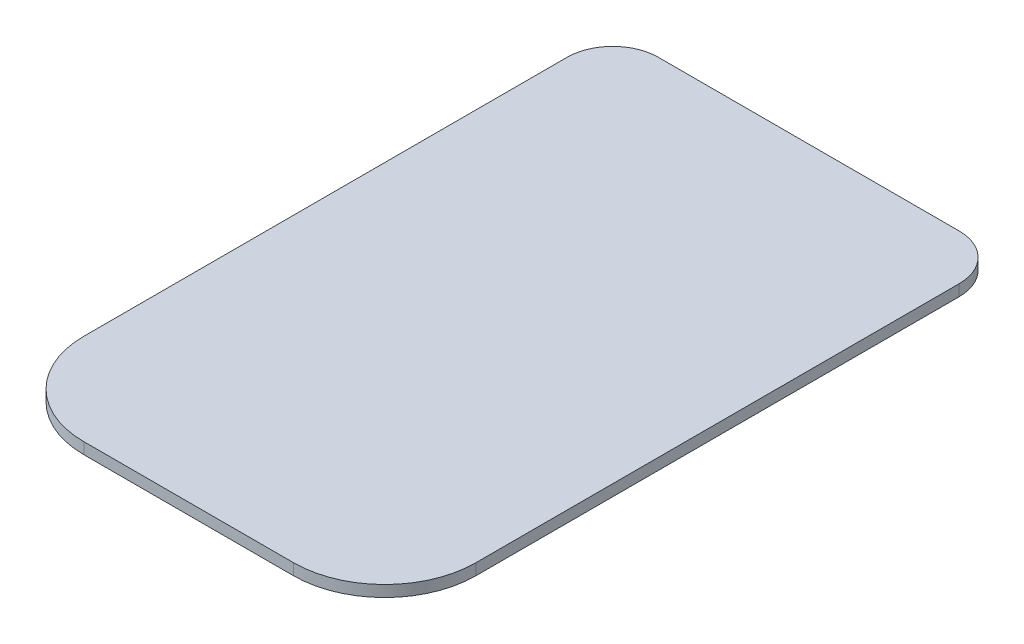
ISO-10303-21;
HEADER;
FILE_DESCRIPTION(('STEP AP214'),'2;1');
FILE_NAME('part.step','',(''),(''),'','','');
FILE_SCHEMA(('AUTOMOTIVE_DESIGN { 1 0 10303 214 1 1 1 1 }'));
ENDSEC;
DATA;
#1=APPLICATION_CONTEXT('core data for automotive mechanical design processes');
#2=APPLICATION_PROTOCOL_DEFINITION('international standard','automotive_design',2000,#1);
#3=PRODUCT_CONTEXT('',#1,'mechanical');
#4=PRODUCT('Part','Part','',(#3));
#5=PRODUCT_RELATED_PRODUCT_CATEGORY('part','',(#4));
#6=PRODUCT_DEFINITION_FORMATION('','',#4);
#7=PRODUCT_DEFINITION_CONTEXT('part definition',#1,'design');
#8=PRODUCT_DEFINITION('design','',#6,#7);
#9=PRODUCT_DEFINITION_SHAPE('','',#8);
#10=(LENGTH_UNIT() NAMED_UNIT(*) SI_UNIT(.MILLI.,.METRE.));
#11=(NAMED_UNIT(*) PLANE_ANGLE_UNIT() SI_UNIT($,.RADIAN.));
#12=(NAMED_UNIT(*) SI_UNIT($,.STERADIAN.) SOLID_ANGLE_UNIT());
#13=UNCERTAINTY_MEASURE_WITH_UNIT(LENGTH_MEASURE(1.E-05),#10,'distance_accuracy_value','');
#14=(GEOMETRIC_REPRESENTATION_CONTEXT(3) GLOBAL_UNCERTAINTY_ASSIGNED_CONTEXT((#13)) GLOBAL_UNIT_ASSIGNED_CONTEXT((#10,
#11,#12)) REPRESENTATION_CONTEXT('',''));
#15=CARTESIAN_POINT('',(0.,0.,0.));
#16=DIRECTION('',(0.,0.,1.));
#17=DIRECTION('',(1.,0.,0.));
#18=AXIS2_PLACEMENT_3D('',#15,#16,#17);
#19=CARTESIAN_POINT('',(48.26,1.5748,-80.01));
#20=DIRECTION('',(0.,-1.,0.));
#21=DIRECTION('',(0.,0.,-1.));
#22=AXIS2_PLACEMENT_3D('',#19,#20,#21);
#23=CYLINDRICAL_SURFACE('',#22,6.35);
#24=CARTESIAN_POINT('',(48.26,0.,-80.01));
#25=DIRECTION('',(0.,1.,0.));
#26=DIRECTION('',(0.,0.,1.));
#27=AXIS2_PLACEMENT_3D('',#24,#25,#26);
#28=CIRCLE('',#27,6.35);
#29=CARTESIAN_POINT('',(54.61,0.,-80.01));
#30=VERTEX_POINT('',#29);
#31=CARTESIAN_POINT('',(48.26,0.,-86.36));
#32=VERTEX_POINT('',#31);
#33=EDGE_CURVE('E129',#30,#32,#28,.T.);
#34=ORIENTED_EDGE('',*,*,#33,.T.);
#35=DIRECTION('',(0.,-1.,0.));
#36=VECTOR('',#35,1.);
#37=CARTESIAN_POINT('',(48.26,1.5748,-86.36));
#38=LINE('',#37,#36);
#39=CARTESIAN_POINT('',(48.26,1.5748,-86.36));
#40=VERTEX_POINT('',#39);
#41=EDGE_CURVE('E11',#40,#32,#38,.T.);
#42=ORIENTED_EDGE('',*,*,#41,.F.);
#43=CARTESIAN_POINT('',(48.26,1.5748,-80.01));
#44=DIRECTION('',(0.,1.,0.));
#45=DIRECTION('',(0.,0.,1.));
#46=AXIS2_PLACEMENT_3D('',#43,#44,#45);
#47=CIRCLE('',#46,6.35);
#48=CARTESIAN_POINT('',(54.61,1.5748,-80.01));
#49=VERTEX_POINT('',#48);
#50=EDGE_CURVE('E143',#49,#40,#47,.T.);
#51=ORIENTED_EDGE('',*,*,#50,.F.);
#52=DIRECTION('',(0.,-1.,0.));
#53=VECTOR('',#52,1.);
#54=CARTESIAN_POINT('',(54.61,1.5748,-80.01));
#55=LINE('',#54,#53);
#56=EDGE_CURVE('E125',#49,#30,#55,.T.);
#57=ORIENTED_EDGE('',*,*,#56,.T.);
#58=EDGE_LOOP('',(#34,#42,#51,#57));
#59=FACE_BOUND('',#58,.T.);
#60=ADVANCED_FACE('F33',(#59),#23,.T.);
#61=CARTESIAN_POINT('',(6.35,1.5748,-86.36));
#62=DIRECTION('',(0.,0.,1.));
#63=DIRECTION('',(1.,0.,0.));
#64=AXIS2_PLACEMENT_3D('',#61,#62,#63);
#65=PLANE('',#64);
#66=DIRECTION('',(-1.,0.,0.));
#67=VECTOR('',#66,1.);
#68=CARTESIAN_POINT('',(6.35,0.,-86.36));
#69=LINE('',#68,#67);
#70=CARTESIAN_POINT('',(6.35,0.,-86.36));
#71=VERTEX_POINT('',#70);
#72=EDGE_CURVE('E132',#32,#71,#69,.T.);
#73=ORIENTED_EDGE('',*,*,#72,.T.);
#74=DIRECTION('',(0.,-1.,0.));
#75=VECTOR('',#74,1.);
#76=CARTESIAN_POINT('',(6.35,1.5748,-86.36));
#77=LINE('',#76,#75);
#78=CARTESIAN_POINT('',(6.35,1.5748,-86.36));
#79=VERTEX_POINT('',#78);
#80=EDGE_CURVE('E41',#79,#71,#77,.T.);
#81=ORIENTED_EDGE('',*,*,#80,.F.);
#82=DIRECTION('',(-1.,0.,0.));
#83=VECTOR('',#82,1.);
#84=CARTESIAN_POINT('',(6.35,1.5748,-86.36));
#85=LINE('',#84,#83);
#86=EDGE_CURVE('E92',#40,#79,#85,.T.);
#87=ORIENTED_EDGE('',*,*,#86,.F.);
#88=ORIENTED_EDGE('',*,*,#41,.T.);
#89=EDGE_LOOP('',(#73,#81,#87,#88));
#90=FACE_BOUND('',#89,.T.);
#91=ADVANCED_FACE('F178',(#90),#65,.F.);
#92=CARTESIAN_POINT('',(6.35,1.5748,-80.01));
#93=DIRECTION('',(0.,-1.,0.));
#94=DIRECTION('',(0.,0.,-1.));
#95=AXIS2_PLACEMENT_3D('',#92,#93,#94);
#96=CYLINDRICAL_SURFACE('',#95,6.35);
#97=CARTESIAN_POINT('',(6.35,0.,-80.01));
#98=DIRECTION('',(0.,1.,0.));
#99=DIRECTION('',(0.,0.,-1.));
#100=AXIS2_PLACEMENT_3D('',#97,#98,#99);
#101=CIRCLE('',#100,6.35);
#102=CARTESIAN_POINT('',(0.,0.,-80.01));
#103=VERTEX_POINT('',#102);
#104=EDGE_CURVE('E134',#71,#103,#101,.T.);
#105=ORIENTED_EDGE('',*,*,#104,.T.);
#106=DIRECTION('',(0.,-1.,0.));
#107=VECTOR('',#106,1.);
#108=CARTESIAN_POINT('',(0.,1.5748,-80.01));
#109=LINE('',#108,#107);
#110=CARTESIAN_POINT('',(0.,1.5748,-80.01));
#111=VERTEX_POINT('',#110);
#112=EDGE_CURVE('E150',#111,#103,#109,.T.);
#113=ORIENTED_EDGE('',*,*,#112,.F.);
#114=CARTESIAN_POINT('',(6.35,1.5748,-80.01));
#115=DIRECTION('',(0.,1.,0.));
#116=DIRECTION('',(0.,0.,-1.));
#117=AXIS2_PLACEMENT_3D('',#114,#115,#116);
#118=CIRCLE('',#117,6.35);
#119=EDGE_CURVE('E158',#79,#111,#118,.T.);
#120=ORIENTED_EDGE('',*,*,#119,.F.);
#121=ORIENTED_EDGE('',*,*,#80,.T.);
#122=EDGE_LOOP('',(#105,#113,#120,#121));
#123=FACE_BOUND('',#122,.T.);
#124=ADVANCED_FACE('F156',(#123),#96,.T.);
#125=CARTESIAN_POINT('',(0.,1.5748,-12.7));
#126=DIRECTION('',(1.,0.,0.));
#127=DIRECTION('',(0.,0.,-1.));
#128=AXIS2_PLACEMENT_3D('',#125,#126,#127);
#129=PLANE('',#128);
#130=DIRECTION('',(0.,0.,1.));
#131=VECTOR('',#130,1.);
#132=CARTESIAN_POINT('',(0.,0.,-12.7));
#133=LINE('',#132,#131);
#134=CARTESIAN_POINT('',(0.,0.,-12.7));
#135=VERTEX_POINT('',#134);
#136=EDGE_CURVE('E136',#103,#135,#133,.T.);
#137=ORIENTED_EDGE('',*,*,#136,.T.);
#138=DIRECTION('',(0.,-1.,0.));
#139=VECTOR('',#138,1.);
#140=CARTESIAN_POINT('',(0.,1.5748,-12.7));
#141=LINE('',#140,#139);
#142=CARTESIAN_POINT('',(0.,1.5748,-12.7));
#143=VERTEX_POINT('',#142);
#144=EDGE_CURVE('E147',#143,#135,#141,.T.);
#145=ORIENTED_EDGE('',*,*,#144,.F.);
#146=DIRECTION('',(0.,0.,1.));
#147=VECTOR('',#146,1.);
#148=CARTESIAN_POINT('',(0.,1.5748,-12.7));
#149=LINE('',#148,#147);
#150=EDGE_CURVE('E170',#111,#143,#149,.T.);
#151=ORIENTED_EDGE('',*,*,#150,.F.);
#152=ORIENTED_EDGE('',*,*,#112,.T.);
#153=EDGE_LOOP('',(#137,#145,#151,#152));
#154=FACE_BOUND('',#153,.T.);
#155=ADVANCED_FACE('F166',(#154),#129,.F.);
#156=CARTESIAN_POINT('',(12.7,1.5748,-12.7));
#157=DIRECTION('',(0.,-1.,0.));
#158=DIRECTION('',(0.,0.,-1.));
#159=AXIS2_PLACEMENT_3D('',#156,#157,#158);
#160=CYLINDRICAL_SURFACE('',#159,12.7);
#161=CARTESIAN_POINT('',(12.7,0.,-12.7));
#162=DIRECTION('',(0.,1.,0.));
#163=DIRECTION('',(0.,0.,-1.));
#164=AXIS2_PLACEMENT_3D('',#161,#162,#163);
#165=CIRCLE('',#164,12.7);
#166=CARTESIAN_POINT('',(12.7,0.,0.));
#167=VERTEX_POINT('',#166);
#168=EDGE_CURVE('E138',#135,#167,#165,.T.);
#169=ORIENTED_EDGE('',*,*,#168,.T.);
#170=DIRECTION('',(0.,-1.,0.));
#171=VECTOR('',#170,1.);
#172=CARTESIAN_POINT('',(12.7,1.5748,0.));
#173=LINE('',#172,#171);
#174=CARTESIAN_POINT('',(12.7,1.5748,0.));
#175=VERTEX_POINT('',#174);
#176=EDGE_CURVE('E120',#175,#167,#173,.T.);
#177=ORIENTED_EDGE('',*,*,#176,.F.);
#178=CARTESIAN_POINT('',(12.7,1.5748,-12.7));
#179=DIRECTION('',(0.,1.,0.));
#180=DIRECTION('',(0.,0.,-1.));
#181=AXIS2_PLACEMENT_3D('',#178,#179,#180);
#182=CIRCLE('',#181,12.7);
#183=EDGE_CURVE('E111',#143,#175,#182,.T.);
#184=ORIENTED_EDGE('',*,*,#183,.F.);
#185=ORIENTED_EDGE('',*,*,#144,.T.);
#186=EDGE_LOOP('',(#169,#177,#184,#185));
#187=FACE_BOUND('',#186,.T.);
#188=ADVANCED_FACE('F169',(#187),#160,.T.);
#189=CARTESIAN_POINT('',(12.7,1.5748,0.));
#190=DIRECTION('',(0.,0.,-1.));
#191=DIRECTION('',(-1.,0.,0.));
#192=AXIS2_PLACEMENT_3D('',#189,#190,#191);
#193=PLANE('',#192);
#194=DIRECTION('',(1.,0.,0.));
#195=VECTOR('',#194,1.);
#196=CARTESIAN_POINT('',(12.7,0.,0.));
#197=LINE('',#196,#195);
#198=CARTESIAN_POINT('',(41.91,0.,0.));
#199=VERTEX_POINT('',#198);
#200=EDGE_CURVE('E119',#167,#199,#197,.T.);
#201=ORIENTED_EDGE('',*,*,#200,.T.);
#202=DIRECTION('',(0.,-1.,0.));
#203=VECTOR('',#202,1.);
#204=CARTESIAN_POINT('',(41.91,1.5748,0.));
#205=LINE('',#204,#203);
#206=CARTESIAN_POINT('',(41.91,1.5748,0.));
#207=VERTEX_POINT('',#206);
#208=EDGE_CURVE('E116',#207,#199,#205,.T.);
#209=ORIENTED_EDGE('',*,*,#208,.F.);
#210=DIRECTION('',(1.,0.,0.));
#211=VECTOR('',#210,1.);
#212=CARTESIAN_POINT('',(12.7,1.5748,0.));
#213=LINE('',#212,#211);
#214=EDGE_CURVE('E105',#175,#207,#213,.T.);
#215=ORIENTED_EDGE('',*,*,#214,.F.);
#216=ORIENTED_EDGE('',*,*,#176,.T.);
#217=EDGE_LOOP('',(#201,#209,#215,#216));
#218=FACE_BOUND('',#217,.T.);
#219=ADVANCED_FACE('F117',(#218),#193,.F.);
#220=CARTESIAN_POINT('',(41.91,1.5748,-12.7));
#221=DIRECTION('',(0.,-1.,0.));
#222=DIRECTION('',(0.,0.,-1.));
#223=AXIS2_PLACEMENT_3D('',#220,#221,#222);
#224=CYLINDRICAL_SURFACE('',#223,12.7);
#225=CARTESIAN_POINT('',(41.91,0.,-12.7));
#226=DIRECTION('',(0.,1.,0.));
#227=DIRECTION('',(0.,0.,-1.));
#228=AXIS2_PLACEMENT_3D('',#225,#226,#227);
#229=CIRCLE('',#228,12.7);
#230=CARTESIAN_POINT('',(54.61,0.,-12.7));
#231=VERTEX_POINT('',#230);
#232=EDGE_CURVE('E78',#199,#231,#229,.T.);
#233=ORIENTED_EDGE('',*,*,#232,.T.);
#234=DIRECTION('',(0.,-1.,0.));
#235=VECTOR('',#234,1.);
#236=CARTESIAN_POINT('',(54.61,1.5748,-12.7));
#237=LINE('',#236,#235);
#238=CARTESIAN_POINT('',(54.61,1.5748,-12.7));
#239=VERTEX_POINT('',#238);
#240=EDGE_CURVE('E121',#239,#231,#237,.T.);
#241=ORIENTED_EDGE('',*,*,#240,.F.);
#242=CARTESIAN_POINT('',(41.91,1.5748,-12.7));
#243=DIRECTION('',(0.,1.,0.));
#244=DIRECTION('',(0.,0.,-1.));
#245=AXIS2_PLACEMENT_3D('',#242,#243,#244);
#246=CIRCLE('',#245,12.7);
#247=EDGE_CURVE('E109',#207,#239,#246,.T.);
#248=ORIENTED_EDGE('',*,*,#247,.F.);
#249=ORIENTED_EDGE('',*,*,#208,.T.);
#250=EDGE_LOOP('',(#233,#241,#248,#249));
#251=FACE_BOUND('',#250,.T.);
#252=ADVANCED_FACE('F123',(#251),#224,.T.);
#253=CARTESIAN_POINT('',(54.61,1.5748,-12.7));
#254=DIRECTION('',(-1.,0.,0.));
#255=DIRECTION('',(0.,0.,1.));
#256=AXIS2_PLACEMENT_3D('',#253,#254,#255);
#257=PLANE('',#256);
#258=DIRECTION('',(0.,0.,-1.));
#259=VECTOR('',#258,1.);
#260=CARTESIAN_POINT('',(54.61,0.,-12.7));
#261=LINE('',#260,#259);
#262=EDGE_CURVE('E84',#231,#30,#261,.T.);
#263=ORIENTED_EDGE('',*,*,#262,.T.);
#264=ORIENTED_EDGE('',*,*,#56,.F.);
#265=DIRECTION('',(0.,0.,-1.));
#266=VECTOR('',#265,1.);
#267=CARTESIAN_POINT('',(54.61,1.5748,-12.7));
#268=LINE('',#267,#266);
#269=EDGE_CURVE('E49',#239,#49,#268,.T.);
#270=ORIENTED_EDGE('',*,*,#269,.F.);
#271=ORIENTED_EDGE('',*,*,#240,.T.);
#272=EDGE_LOOP('',(#263,#264,#270,#271));
#273=FACE_BOUND('',#272,.T.);
#274=ADVANCED_FACE('F194',(#273),#257,.F.);
#275=CARTESIAN_POINT('',(48.26,1.5748,-80.01));
#276=DIRECTION('',(0.,1.,0.));
#277=DIRECTION('',(0.,0.,1.));
#278=AXIS2_PLACEMENT_3D('',#275,#276,#277);
#279=PLANE('',#278);
#280=ORIENTED_EDGE('',*,*,#50,.T.);
#281=ORIENTED_EDGE('',*,*,#86,.T.);
#282=ORIENTED_EDGE('',*,*,#119,.T.);
#283=ORIENTED_EDGE('',*,*,#150,.T.);
#284=ORIENTED_EDGE('',*,*,#183,.T.);
#285=ORIENTED_EDGE('',*,*,#214,.T.);
#286=ORIENTED_EDGE('',*,*,#247,.T.);
#287=ORIENTED_EDGE('',*,*,#269,.T.);
#288=EDGE_LOOP('',(#280,#281,#282,#283,#284,#285,#286,#287));
#289=FACE_BOUND('',#288,.T.);
#290=ADVANCED_FACE('F107',(#289),#279,.T.);
#291=CARTESIAN_POINT('',(48.26,0.,-80.01));
#292=DIRECTION('',(0.,1.,0.));
#293=DIRECTION('',(0.,0.,1.));
#294=AXIS2_PLACEMENT_3D('',#291,#292,#293);
#295=PLANE('',#294);
#296=ORIENTED_EDGE('',*,*,#33,.F.);
#297=ORIENTED_EDGE('',*,*,#262,.F.);
#298=ORIENTED_EDGE('',*,*,#232,.F.);
#299=ORIENTED_EDGE('',*,*,#200,.F.);
#300=ORIENTED_EDGE('',*,*,#168,.F.);
#301=ORIENTED_EDGE('',*,*,#136,.F.);
#302=ORIENTED_EDGE('',*,*,#104,.F.);
#303=ORIENTED_EDGE('',*,*,#72,.F.);
#304=EDGE_LOOP('',(#296,#297,#298,#299,#300,#301,#302,#303));
#305=FACE_BOUND('',#304,.T.);
#306=ADVANCED_FACE('F162',(#305),#295,.F.);
#307=CLOSED_SHELL('',(#60,#91,#124,#155,#188,#219,#252,#274,#290,#306));
#308=MANIFOLD_SOLID_BREP('B2',#307);
#309=ADVANCED_BREP_SHAPE_REPRESENTATION('',(#18,#308),#14);
#310=SHAPE_DEFINITION_REPRESENTATION(#9,#309);
ENDSEC;
END-ISO-10303-21;
